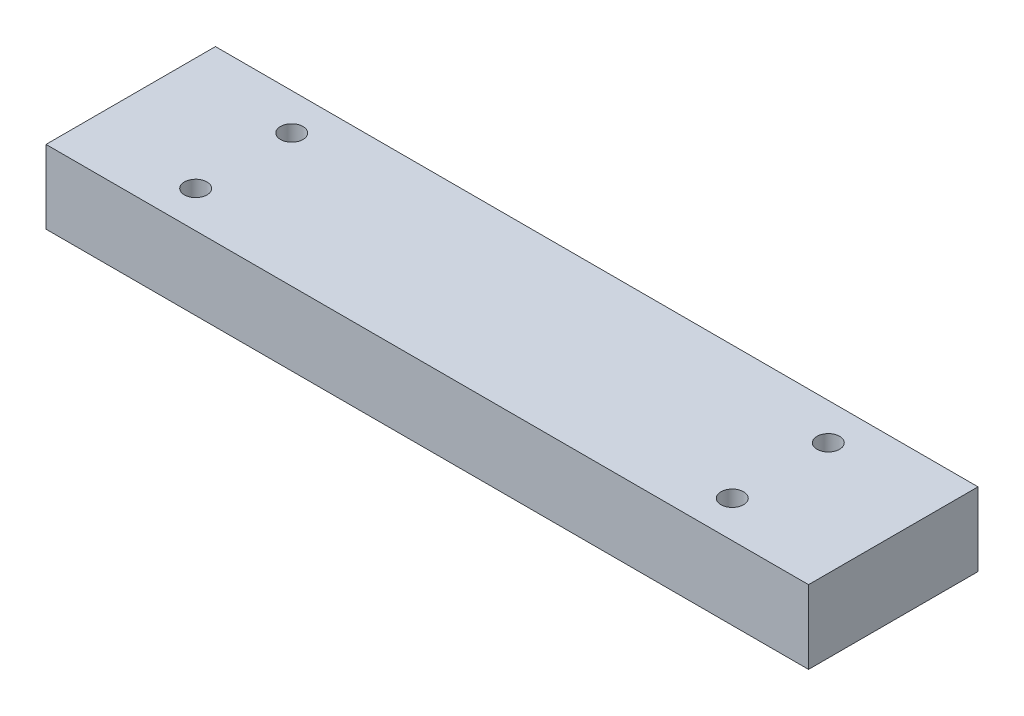
ISO-10303-21;
HEADER;
FILE_DESCRIPTION(('STEP AP214'),'2;1');
FILE_NAME('part.step','',(''),(''),'','','');
FILE_SCHEMA(('AUTOMOTIVE_DESIGN { 1 0 10303 214 1 1 1 1 }'));
ENDSEC;
DATA;
#1=APPLICATION_CONTEXT('core data for automotive mechanical design processes');
#2=APPLICATION_PROTOCOL_DEFINITION('international standard','automotive_design',2000,#1);
#3=PRODUCT_CONTEXT('',#1,'mechanical');
#4=PRODUCT('Part','Part','',(#3));
#5=PRODUCT_RELATED_PRODUCT_CATEGORY('part','',(#4));
#6=PRODUCT_DEFINITION_FORMATION('','',#4);
#7=PRODUCT_DEFINITION_CONTEXT('part definition',#1,'design');
#8=PRODUCT_DEFINITION('design','',#6,#7);
#9=PRODUCT_DEFINITION_SHAPE('','',#8);
#10=(LENGTH_UNIT() NAMED_UNIT(*) SI_UNIT(.MILLI.,.METRE.));
#11=(NAMED_UNIT(*) PLANE_ANGLE_UNIT() SI_UNIT($,.RADIAN.));
#12=(NAMED_UNIT(*) SI_UNIT($,.STERADIAN.) SOLID_ANGLE_UNIT());
#13=UNCERTAINTY_MEASURE_WITH_UNIT(LENGTH_MEASURE(1.E-05),#10,'distance_accuracy_value','');
#14=(GEOMETRIC_REPRESENTATION_CONTEXT(3) GLOBAL_UNCERTAINTY_ASSIGNED_CONTEXT((#13)) GLOBAL_UNIT_ASSIGNED_CONTEXT((#10,
#11,#12)) REPRESENTATION_CONTEXT('',''));
#15=CARTESIAN_POINT('',(0.,0.,0.));
#16=DIRECTION('',(0.,0.,1.));
#17=DIRECTION('',(1.,0.,0.));
#18=AXIS2_PLACEMENT_3D('',#15,#16,#17);
#19=CARTESIAN_POINT('',(0.,13.,0.));
#20=DIRECTION('',(1.,0.,0.));
#21=DIRECTION('',(0.,0.,-1.));
#22=AXIS2_PLACEMENT_3D('',#19,#20,#21);
#23=PLANE('',#22);
#24=DIRECTION('',(0.,0.,1.));
#25=VECTOR('',#24,1.);
#26=CARTESIAN_POINT('',(0.,0.,0.));
#27=LINE('',#26,#25);
#28=CARTESIAN_POINT('',(0.,0.,-30.));
#29=VERTEX_POINT('',#28);
#30=CARTESIAN_POINT('',(0.,0.,0.));
#31=VERTEX_POINT('',#30);
#32=EDGE_CURVE('E118',#29,#31,#27,.T.);
#33=ORIENTED_EDGE('',*,*,#32,.T.);
#34=DIRECTION('',(0.,-1.,0.));
#35=VECTOR('',#34,1.);
#36=CARTESIAN_POINT('',(0.,13.,0.));
#37=LINE('',#36,#35);
#38=CARTESIAN_POINT('',(0.,13.,0.));
#39=VERTEX_POINT('',#38);
#40=EDGE_CURVE('E11',#39,#31,#37,.T.);
#41=ORIENTED_EDGE('',*,*,#40,.F.);
#42=DIRECTION('',(0.,0.,1.));
#43=VECTOR('',#42,1.);
#44=CARTESIAN_POINT('',(0.,13.,0.));
#45=LINE('',#44,#43);
#46=CARTESIAN_POINT('',(0.,13.,-30.));
#47=VERTEX_POINT('',#46);
#48=EDGE_CURVE('E101',#47,#39,#45,.T.);
#49=ORIENTED_EDGE('',*,*,#48,.F.);
#50=DIRECTION('',(0.,-1.,0.));
#51=VECTOR('',#50,1.);
#52=CARTESIAN_POINT('',(0.,13.,-30.));
#53=LINE('',#52,#51);
#54=EDGE_CURVE('E114',#47,#29,#53,.T.);
#55=ORIENTED_EDGE('',*,*,#54,.T.);
#56=EDGE_LOOP('',(#33,#41,#49,#55));
#57=FACE_BOUND('',#56,.T.);
#58=ADVANCED_FACE('F47',(#57),#23,.F.);
#59=CARTESIAN_POINT('',(0.,13.,0.));
#60=DIRECTION('',(0.,0.,-1.));
#61=DIRECTION('',(-1.,0.,0.));
#62=AXIS2_PLACEMENT_3D('',#59,#60,#61);
#63=PLANE('',#62);
#64=DIRECTION('',(1.,0.,0.));
#65=VECTOR('',#64,1.);
#66=CARTESIAN_POINT('',(0.,0.,0.));
#67=LINE('',#66,#65);
#68=CARTESIAN_POINT('',(135.,0.,0.));
#69=VERTEX_POINT('',#68);
#70=EDGE_CURVE('E106',#31,#69,#67,.T.);
#71=ORIENTED_EDGE('',*,*,#70,.T.);
#72=DIRECTION('',(0.,-1.,0.));
#73=VECTOR('',#72,1.);
#74=CARTESIAN_POINT('',(135.,13.,0.));
#75=LINE('',#74,#73);
#76=CARTESIAN_POINT('',(135.,13.,0.));
#77=VERTEX_POINT('',#76);
#78=EDGE_CURVE('E57',#77,#69,#75,.T.);
#79=ORIENTED_EDGE('',*,*,#78,.F.);
#80=DIRECTION('',(1.,0.,0.));
#81=VECTOR('',#80,1.);
#82=CARTESIAN_POINT('',(0.,13.,0.));
#83=LINE('',#82,#81);
#84=EDGE_CURVE('E96',#39,#77,#83,.T.);
#85=ORIENTED_EDGE('',*,*,#84,.F.);
#86=ORIENTED_EDGE('',*,*,#40,.T.);
#87=EDGE_LOOP('',(#71,#79,#85,#86));
#88=FACE_BOUND('',#87,.T.);
#89=ADVANCED_FACE('F105',(#88),#63,.F.);
#90=CARTESIAN_POINT('',(135.,13.,0.));
#91=DIRECTION('',(-1.,0.,0.));
#92=DIRECTION('',(0.,0.,1.));
#93=AXIS2_PLACEMENT_3D('',#90,#91,#92);
#94=PLANE('',#93);
#95=DIRECTION('',(0.,0.,-1.));
#96=VECTOR('',#95,1.);
#97=CARTESIAN_POINT('',(135.,0.,0.));
#98=LINE('',#97,#96);
#99=CARTESIAN_POINT('',(135.,0.,-30.));
#100=VERTEX_POINT('',#99);
#101=EDGE_CURVE('E83',#69,#100,#98,.T.);
#102=ORIENTED_EDGE('',*,*,#101,.T.);
#103=DIRECTION('',(0.,-1.,0.));
#104=VECTOR('',#103,1.);
#105=CARTESIAN_POINT('',(135.,13.,-30.));
#106=LINE('',#105,#104);
#107=CARTESIAN_POINT('',(135.,13.,-30.));
#108=VERTEX_POINT('',#107);
#109=EDGE_CURVE('E108',#108,#100,#106,.T.);
#110=ORIENTED_EDGE('',*,*,#109,.F.);
#111=DIRECTION('',(0.,0.,-1.));
#112=VECTOR('',#111,1.);
#113=CARTESIAN_POINT('',(135.,13.,0.));
#114=LINE('',#113,#112);
#115=EDGE_CURVE('E99',#77,#108,#114,.T.);
#116=ORIENTED_EDGE('',*,*,#115,.F.);
#117=ORIENTED_EDGE('',*,*,#78,.T.);
#118=EDGE_LOOP('',(#102,#110,#116,#117));
#119=FACE_BOUND('',#118,.T.);
#120=ADVANCED_FACE('F110',(#119),#94,.F.);
#121=CARTESIAN_POINT('',(0.,13.,-30.));
#122=DIRECTION('',(0.,0.,1.));
#123=DIRECTION('',(1.,0.,0.));
#124=AXIS2_PLACEMENT_3D('',#121,#122,#123);
#125=PLANE('',#124);
#126=DIRECTION('',(-1.,0.,0.));
#127=VECTOR('',#126,1.);
#128=CARTESIAN_POINT('',(0.,0.,-30.));
#129=LINE('',#128,#127);
#130=EDGE_CURVE('E89',#100,#29,#129,.T.);
#131=ORIENTED_EDGE('',*,*,#130,.T.);
#132=ORIENTED_EDGE('',*,*,#54,.F.);
#133=DIRECTION('',(-1.,0.,0.));
#134=VECTOR('',#133,1.);
#135=CARTESIAN_POINT('',(0.,13.,-30.));
#136=LINE('',#135,#134);
#137=EDGE_CURVE('E66',#108,#47,#136,.T.);
#138=ORIENTED_EDGE('',*,*,#137,.F.);
#139=ORIENTED_EDGE('',*,*,#109,.T.);
#140=EDGE_LOOP('',(#131,#132,#138,#139));
#141=FACE_BOUND('',#140,.T.);
#142=ADVANCED_FACE('F164',(#141),#125,.F.);
#143=CARTESIAN_POINT('',(0.,13.,0.));
#144=DIRECTION('',(0.,-1.,0.));
#145=DIRECTION('',(0.,0.,-1.));
#146=AXIS2_PLACEMENT_3D('',#143,#144,#145);
#147=PLANE('',#146);
#148=CARTESIAN_POINT('',(20.,13.,-23.5));
#149=DIRECTION('',(0.,1.,0.));
#150=DIRECTION('',(0.,0.,1.));
#151=AXIS2_PLACEMENT_3D('',#148,#149,#150);
#152=CIRCLE('',#151,2.);
#153=CARTESIAN_POINT('',(20.,13.,-21.5));
#154=VERTEX_POINT('',#153);
#155=EDGE_CURVE('E248',#154,#154,#152,.T.);
#156=ORIENTED_EDGE('',*,*,#155,.F.);
#157=EDGE_LOOP('',(#156));
#158=FACE_BOUND('',#157,.T.);
#159=CARTESIAN_POINT('',(20.,13.,-6.5));
#160=DIRECTION('',(0.,1.,0.));
#161=DIRECTION('',(0.,0.,1.));
#162=AXIS2_PLACEMENT_3D('',#159,#160,#161);
#163=CIRCLE('',#162,2.);
#164=CARTESIAN_POINT('',(20.,13.,-4.5));
#165=VERTEX_POINT('',#164);
#166=EDGE_CURVE('E244',#165,#165,#163,.T.);
#167=ORIENTED_EDGE('',*,*,#166,.F.);
#168=EDGE_LOOP('',(#167));
#169=FACE_BOUND('',#168,.T.);
#170=CARTESIAN_POINT('',(115.,13.,-6.5));
#171=DIRECTION('',(0.,1.,0.));
#172=DIRECTION('',(0.,0.,1.));
#173=AXIS2_PLACEMENT_3D('',#170,#171,#172);
#174=CIRCLE('',#173,2.);
#175=CARTESIAN_POINT('',(115.,13.,-4.5));
#176=VERTEX_POINT('',#175);
#177=EDGE_CURVE('E247',#176,#176,#174,.T.);
#178=ORIENTED_EDGE('',*,*,#177,.F.);
#179=EDGE_LOOP('',(#178));
#180=FACE_BOUND('',#179,.T.);
#181=CARTESIAN_POINT('',(115.,13.,-23.5));
#182=DIRECTION('',(0.,1.,0.));
#183=DIRECTION('',(0.,0.,1.));
#184=AXIS2_PLACEMENT_3D('',#181,#182,#183);
#185=CIRCLE('',#184,2.);
#186=CARTESIAN_POINT('',(115.,13.,-21.5));
#187=VERTEX_POINT('',#186);
#188=EDGE_CURVE('E137',#187,#187,#185,.T.);
#189=ORIENTED_EDGE('',*,*,#188,.F.);
#190=EDGE_LOOP('',(#189));
#191=FACE_BOUND('',#190,.T.);
#192=ORIENTED_EDGE('',*,*,#48,.T.);
#193=ORIENTED_EDGE('',*,*,#84,.T.);
#194=ORIENTED_EDGE('',*,*,#115,.T.);
#195=ORIENTED_EDGE('',*,*,#137,.T.);
#196=EDGE_LOOP('',(#192,#193,#194,#195));
#197=FACE_BOUND('',#196,.T.);
#198=ADVANCED_FACE('F97',(#158,#169,#180,#191,#197),#147,.F.);
#199=CARTESIAN_POINT('',(0.,0.,0.));
#200=DIRECTION('',(0.,-1.,0.));
#201=DIRECTION('',(0.,0.,-1.));
#202=AXIS2_PLACEMENT_3D('',#199,#200,#201);
#203=PLANE('',#202);
#204=CARTESIAN_POINT('',(20.,0.,-23.5));
#205=DIRECTION('',(0.,-1.,0.));
#206=DIRECTION('',(0.,0.,-1.));
#207=AXIS2_PLACEMENT_3D('',#204,#205,#206);
#208=CIRCLE('',#207,2.);
#209=CARTESIAN_POINT('',(20.,0.,-25.5));
#210=VERTEX_POINT('',#209);
#211=EDGE_CURVE('E50',#210,#210,#208,.T.);
#212=ORIENTED_EDGE('',*,*,#211,.F.);
#213=EDGE_LOOP('',(#212));
#214=FACE_BOUND('',#213,.T.);
#215=CARTESIAN_POINT('',(20.,0.,-6.5));
#216=DIRECTION('',(0.,-1.,0.));
#217=DIRECTION('',(0.,0.,-1.));
#218=AXIS2_PLACEMENT_3D('',#215,#216,#217);
#219=CIRCLE('',#218,2.);
#220=CARTESIAN_POINT('',(20.,0.,-8.5));
#221=VERTEX_POINT('',#220);
#222=EDGE_CURVE('E140',#221,#221,#219,.T.);
#223=ORIENTED_EDGE('',*,*,#222,.F.);
#224=EDGE_LOOP('',(#223));
#225=FACE_BOUND('',#224,.T.);
#226=CARTESIAN_POINT('',(115.,0.,-6.5));
#227=DIRECTION('',(0.,-1.,0.));
#228=DIRECTION('',(0.,0.,-1.));
#229=AXIS2_PLACEMENT_3D('',#226,#227,#228);
#230=CIRCLE('',#229,2.);
#231=CARTESIAN_POINT('',(115.,0.,-8.49999999999999));
#232=VERTEX_POINT('',#231);
#233=EDGE_CURVE('E136',#232,#232,#230,.T.);
#234=ORIENTED_EDGE('',*,*,#233,.F.);
#235=EDGE_LOOP('',(#234));
#236=FACE_BOUND('',#235,.T.);
#237=CARTESIAN_POINT('',(115.,0.,-23.5));
#238=DIRECTION('',(0.,-1.,0.));
#239=DIRECTION('',(0.,0.,-1.));
#240=AXIS2_PLACEMENT_3D('',#237,#238,#239);
#241=CIRCLE('',#240,2.);
#242=CARTESIAN_POINT('',(115.,0.,-25.5));
#243=VERTEX_POINT('',#242);
#244=EDGE_CURVE('E132',#243,#243,#241,.T.);
#245=ORIENTED_EDGE('',*,*,#244,.F.);
#246=EDGE_LOOP('',(#245));
#247=FACE_BOUND('',#246,.T.);
#248=ORIENTED_EDGE('',*,*,#32,.F.);
#249=ORIENTED_EDGE('',*,*,#130,.F.);
#250=ORIENTED_EDGE('',*,*,#101,.F.);
#251=ORIENTED_EDGE('',*,*,#70,.F.);
#252=EDGE_LOOP('',(#248,#249,#250,#251));
#253=FACE_BOUND('',#252,.T.);
#254=ADVANCED_FACE('F152',(#214,#225,#236,#247,#253),#203,.T.);
#255=CARTESIAN_POINT('',(115.,-22.,-23.5));
#256=DIRECTION('',(0.,1.,0.));
#257=DIRECTION('',(0.,0.,1.));
#258=AXIS2_PLACEMENT_3D('',#255,#256,#257);
#259=CYLINDRICAL_SURFACE('',#258,2.);
#260=ORIENTED_EDGE('',*,*,#244,.T.);
#261=EDGE_LOOP('',(#260));
#262=FACE_BOUND('',#261,.T.);
#263=ORIENTED_EDGE('',*,*,#188,.T.);
#264=EDGE_LOOP('',(#263));
#265=FACE_BOUND('',#264,.T.);
#266=ADVANCED_FACE('F155',(#262,#265),#259,.F.);
#267=CARTESIAN_POINT('',(115.,-22.,-6.5));
#268=DIRECTION('',(0.,1.,0.));
#269=DIRECTION('',(0.,0.,1.));
#270=AXIS2_PLACEMENT_3D('',#267,#268,#269);
#271=CYLINDRICAL_SURFACE('',#270,2.);
#272=ORIENTED_EDGE('',*,*,#233,.T.);
#273=EDGE_LOOP('',(#272));
#274=FACE_BOUND('',#273,.T.);
#275=ORIENTED_EDGE('',*,*,#177,.T.);
#276=EDGE_LOOP('',(#275));
#277=FACE_BOUND('',#276,.T.);
#278=ADVANCED_FACE('F211',(#274,#277),#271,.F.);
#279=CARTESIAN_POINT('',(20.,-22.,-6.5));
#280=DIRECTION('',(0.,1.,0.));
#281=DIRECTION('',(0.,0.,1.));
#282=AXIS2_PLACEMENT_3D('',#279,#280,#281);
#283=CYLINDRICAL_SURFACE('',#282,2.);
#284=ORIENTED_EDGE('',*,*,#222,.T.);
#285=EDGE_LOOP('',(#284));
#286=FACE_BOUND('',#285,.T.);
#287=ORIENTED_EDGE('',*,*,#166,.T.);
#288=EDGE_LOOP('',(#287));
#289=FACE_BOUND('',#288,.T.);
#290=ADVANCED_FACE('F221',(#286,#289),#283,.F.);
#291=CARTESIAN_POINT('',(20.,-22.,-23.5));
#292=DIRECTION('',(0.,1.,0.));
#293=DIRECTION('',(0.,0.,1.));
#294=AXIS2_PLACEMENT_3D('',#291,#292,#293);
#295=CYLINDRICAL_SURFACE('',#294,2.);
#296=ORIENTED_EDGE('',*,*,#211,.T.);
#297=EDGE_LOOP('',(#296));
#298=FACE_BOUND('',#297,.T.);
#299=ORIENTED_EDGE('',*,*,#155,.T.);
#300=EDGE_LOOP('',(#299));
#301=FACE_BOUND('',#300,.T.);
#302=ADVANCED_FACE('F149',(#298,#301),#295,.F.);
#303=CLOSED_SHELL('',(#58,#89,#120,#142,#198,#254,#266,#278,#290,#302));
#304=MANIFOLD_SOLID_BREP('B2',#303);
#305=ADVANCED_BREP_SHAPE_REPRESENTATION('',(#18,#304),#14);
#306=SHAPE_DEFINITION_REPRESENTATION(#9,#305);
ENDSEC;
END-ISO-10303-21;
